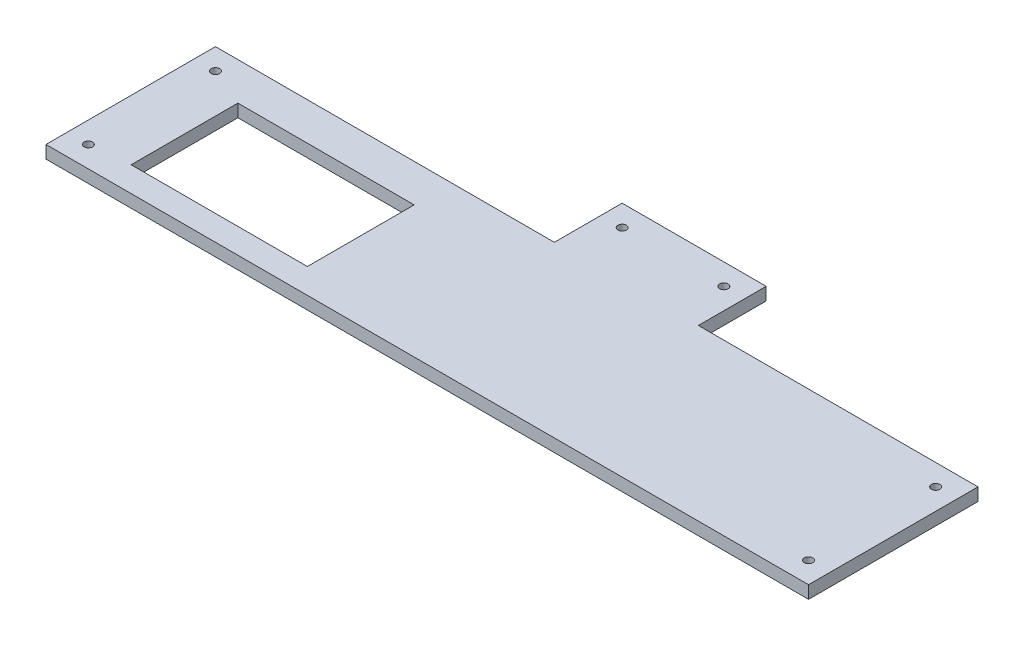
ISO-10303-21;
HEADER;
FILE_DESCRIPTION(('STEP AP214'),'2;1');
FILE_NAME('part.step','',(''),(''),'','','');
FILE_SCHEMA(('AUTOMOTIVE_DESIGN { 1 0 10303 214 1 1 1 1 }'));
ENDSEC;
DATA;
#1=APPLICATION_CONTEXT('core data for automotive mechanical design processes');
#2=APPLICATION_PROTOCOL_DEFINITION('international standard','automotive_design',2000,#1);
#3=PRODUCT_CONTEXT('',#1,'mechanical');
#4=PRODUCT('Part','Part','',(#3));
#5=PRODUCT_RELATED_PRODUCT_CATEGORY('part','',(#4));
#6=PRODUCT_DEFINITION_FORMATION('','',#4);
#7=PRODUCT_DEFINITION_CONTEXT('part definition',#1,'design');
#8=PRODUCT_DEFINITION('design','',#6,#7);
#9=PRODUCT_DEFINITION_SHAPE('','',#8);
#10=(LENGTH_UNIT() NAMED_UNIT(*) SI_UNIT(.MILLI.,.METRE.));
#11=(NAMED_UNIT(*) PLANE_ANGLE_UNIT() SI_UNIT($,.RADIAN.));
#12=(NAMED_UNIT(*) SI_UNIT($,.STERADIAN.) SOLID_ANGLE_UNIT());
#13=UNCERTAINTY_MEASURE_WITH_UNIT(LENGTH_MEASURE(1.E-05),#10,'distance_accuracy_value','');
#14=(GEOMETRIC_REPRESENTATION_CONTEXT(3) GLOBAL_UNCERTAINTY_ASSIGNED_CONTEXT((#13)) GLOBAL_UNIT_ASSIGNED_CONTEXT((#10,
#11,#12)) REPRESENTATION_CONTEXT('',''));
#15=CARTESIAN_POINT('',(0.,0.,0.));
#16=DIRECTION('',(0.,0.,1.));
#17=DIRECTION('',(1.,0.,0.));
#18=AXIS2_PLACEMENT_3D('',#15,#16,#17);
#19=CARTESIAN_POINT('',(450.,-15.,-100.000000000001));
#20=DIRECTION('',(0.,0.,-1.));
#21=DIRECTION('',(-1.,0.,0.));
#22=AXIS2_PLACEMENT_3D('',#19,#20,#21);
#23=PLANE('',#22);
#24=DIRECTION('',(-1.,0.,0.));
#25=VECTOR('',#24,1.);
#26=CARTESIAN_POINT('',(450.,-15.,-100.000000000001));
#27=LINE('',#26,#25);
#28=CARTESIAN_POINT('',(450.,-15.,-100.000000000001));
#29=VERTEX_POINT('',#28);
#30=CARTESIAN_POINT('',(120.,-15.,-100.000000000001));
#31=VERTEX_POINT('',#30);
#32=EDGE_CURVE('E224',#29,#31,#27,.T.);
#33=ORIENTED_EDGE('',*,*,#32,.T.);
#34=DIRECTION('',(0.,1.,0.));
#35=VECTOR('',#34,1.);
#36=CARTESIAN_POINT('',(120.,-15.,-100.000000000001));
#37=LINE('',#36,#35);
#38=CARTESIAN_POINT('',(120.,0.,-100.000000000001));
#39=VERTEX_POINT('',#38);
#40=EDGE_CURVE('E147',#31,#39,#37,.T.);
#41=ORIENTED_EDGE('',*,*,#40,.T.);
#42=DIRECTION('',(-1.,0.,0.));
#43=VECTOR('',#42,1.);
#44=CARTESIAN_POINT('',(450.,0.,-100.000000000001));
#45=LINE('',#44,#43);
#46=CARTESIAN_POINT('',(450.,0.,-100.000000000001));
#47=VERTEX_POINT('',#46);
#48=EDGE_CURVE('E235',#47,#39,#45,.T.);
#49=ORIENTED_EDGE('',*,*,#48,.F.);
#50=DIRECTION('',(0.,1.,0.));
#51=VECTOR('',#50,1.);
#52=CARTESIAN_POINT('',(450.,-15.,-100.000000000001));
#53=LINE('',#52,#51);
#54=EDGE_CURVE('E39',#29,#47,#53,.T.);
#55=ORIENTED_EDGE('',*,*,#54,.F.);
#56=EDGE_LOOP('',(#33,#41,#49,#55));
#57=FACE_BOUND('',#56,.T.);
#58=ADVANCED_FACE('F35',(#57),#23,.T.);
#59=CARTESIAN_POINT('',(450.,-15.,100.000000000001));
#60=DIRECTION('',(1.,0.,0.));
#61=DIRECTION('',(0.,0.,-1.));
#62=AXIS2_PLACEMENT_3D('',#59,#60,#61);
#63=PLANE('',#62);
#64=DIRECTION('',(0.,0.,-1.));
#65=VECTOR('',#64,1.);
#66=CARTESIAN_POINT('',(450.,0.,100.000000000001));
#67=LINE('',#66,#65);
#68=CARTESIAN_POINT('',(450.,0.,100.000000000001));
#69=VERTEX_POINT('',#68);
#70=EDGE_CURVE('E216',#69,#47,#67,.T.);
#71=ORIENTED_EDGE('',*,*,#70,.F.);
#72=DIRECTION('',(0.,1.,0.));
#73=VECTOR('',#72,1.);
#74=CARTESIAN_POINT('',(450.,-15.,100.000000000001));
#75=LINE('',#74,#73);
#76=CARTESIAN_POINT('',(450.,-15.,100.000000000001));
#77=VERTEX_POINT('',#76);
#78=EDGE_CURVE('E11',#77,#69,#75,.T.);
#79=ORIENTED_EDGE('',*,*,#78,.F.);
#80=DIRECTION('',(0.,0.,-1.));
#81=VECTOR('',#80,1.);
#82=CARTESIAN_POINT('',(450.,-15.,100.000000000001));
#83=LINE('',#82,#81);
#84=EDGE_CURVE('E219',#77,#29,#83,.T.);
#85=ORIENTED_EDGE('',*,*,#84,.T.);
#86=ORIENTED_EDGE('',*,*,#54,.T.);
#87=EDGE_LOOP('',(#71,#79,#85,#86));
#88=FACE_BOUND('',#87,.T.);
#89=ADVANCED_FACE('F37',(#88),#63,.T.);
#90=CARTESIAN_POINT('',(-450.,-15.,100.000000000001));
#91=DIRECTION('',(0.,0.,1.));
#92=DIRECTION('',(1.,0.,0.));
#93=AXIS2_PLACEMENT_3D('',#90,#91,#92);
#94=PLANE('',#93);
#95=DIRECTION('',(1.,0.,0.));
#96=VECTOR('',#95,1.);
#97=CARTESIAN_POINT('',(-450.,0.,100.000000000001));
#98=LINE('',#97,#96);
#99=CARTESIAN_POINT('',(-450.,0.,100.000000000001));
#100=VERTEX_POINT('',#99);
#101=EDGE_CURVE('E223',#100,#69,#98,.T.);
#102=ORIENTED_EDGE('',*,*,#101,.F.);
#103=DIRECTION('',(0.,1.,0.));
#104=VECTOR('',#103,1.);
#105=CARTESIAN_POINT('',(-450.,-15.,100.000000000001));
#106=LINE('',#105,#104);
#107=CARTESIAN_POINT('',(-450.,-15.,100.000000000001));
#108=VERTEX_POINT('',#107);
#109=EDGE_CURVE('E44',#108,#100,#106,.T.);
#110=ORIENTED_EDGE('',*,*,#109,.F.);
#111=DIRECTION('',(1.,0.,0.));
#112=VECTOR('',#111,1.);
#113=CARTESIAN_POINT('',(-450.,-15.,100.000000000001));
#114=LINE('',#113,#112);
#115=EDGE_CURVE('E229',#108,#77,#114,.T.);
#116=ORIENTED_EDGE('',*,*,#115,.T.);
#117=ORIENTED_EDGE('',*,*,#78,.T.);
#118=EDGE_LOOP('',(#102,#110,#116,#117));
#119=FACE_BOUND('',#118,.T.);
#120=ADVANCED_FACE('F258',(#119),#94,.T.);
#121=CARTESIAN_POINT('',(-450.,-15.,-100.));
#122=DIRECTION('',(-1.,0.,0.));
#123=DIRECTION('',(0.,0.,1.));
#124=AXIS2_PLACEMENT_3D('',#121,#122,#123);
#125=PLANE('',#124);
#126=DIRECTION('',(0.,0.,1.));
#127=VECTOR('',#126,1.);
#128=CARTESIAN_POINT('',(-450.,0.,-100.));
#129=LINE('',#128,#127);
#130=CARTESIAN_POINT('',(-450.,0.,-100.));
#131=VERTEX_POINT('',#130);
#132=EDGE_CURVE('E238',#131,#100,#129,.T.);
#133=ORIENTED_EDGE('',*,*,#132,.F.);
#134=DIRECTION('',(0.,1.,0.));
#135=VECTOR('',#134,1.);
#136=CARTESIAN_POINT('',(-450.,-15.,-100.));
#137=LINE('',#136,#135);
#138=CARTESIAN_POINT('',(-450.,-15.,-100.));
#139=VERTEX_POINT('',#138);
#140=EDGE_CURVE('E243',#139,#131,#137,.T.);
#141=ORIENTED_EDGE('',*,*,#140,.F.);
#142=DIRECTION('',(0.,0.,1.));
#143=VECTOR('',#142,1.);
#144=CARTESIAN_POINT('',(-450.,-15.,-100.));
#145=LINE('',#144,#143);
#146=EDGE_CURVE('E226',#139,#108,#145,.T.);
#147=ORIENTED_EDGE('',*,*,#146,.T.);
#148=ORIENTED_EDGE('',*,*,#109,.T.);
#149=EDGE_LOOP('',(#133,#141,#147,#148));
#150=FACE_BOUND('',#149,.T.);
#151=ADVANCED_FACE('F262',(#150),#125,.T.);
#152=DIRECTION('',(0.,1.,0.));
#153=VECTOR('',#152,1.);
#154=CARTESIAN_POINT('',(-50.,-15.,-100.000000000001));
#155=LINE('',#154,#153);
#156=CARTESIAN_POINT('',(-50.,-15.,-100.000000000001));
#157=VERTEX_POINT('',#156);
#158=CARTESIAN_POINT('',(-50.,0.,-100.000000000001));
#159=VERTEX_POINT('',#158);
#160=EDGE_CURVE('E161',#157,#159,#155,.T.);
#161=ORIENTED_EDGE('',*,*,#160,.F.);
#162=EDGE_CURVE('E222',#157,#139,#27,.T.);
#163=ORIENTED_EDGE('',*,*,#162,.T.);
#164=ORIENTED_EDGE('',*,*,#140,.T.);
#165=EDGE_CURVE('E234',#159,#131,#45,.T.);
#166=ORIENTED_EDGE('',*,*,#165,.F.);
#167=EDGE_LOOP('',(#161,#163,#164,#166));
#168=FACE_BOUND('',#167,.T.);
#169=ADVANCED_FACE('F264',(#168),#23,.T.);
#170=CARTESIAN_POINT('',(0.,-15.,0.));
#171=DIRECTION('',(0.,1.,0.));
#172=DIRECTION('',(0.,0.,1.));
#173=AXIS2_PLACEMENT_3D('',#170,#171,#172);
#174=PLANE('',#173);
#175=DIRECTION('',(1.,0.,0.));
#176=VECTOR('',#175,1.);
#177=CARTESIAN_POINT('',(-379.,-15.,-55.5000000000002));
#178=LINE('',#177,#176);
#179=CARTESIAN_POINT('',(-379.,-15.,-55.5000000000002));
#180=VERTEX_POINT('',#179);
#181=CARTESIAN_POINT('',(-171.,-15.,-55.5000000000002));
#182=VERTEX_POINT('',#181);
#183=EDGE_CURVE('E179',#180,#182,#178,.T.);
#184=ORIENTED_EDGE('',*,*,#183,.F.);
#185=DIRECTION('',(0.,0.,-1.));
#186=VECTOR('',#185,1.);
#187=CARTESIAN_POINT('',(-379.,-15.,70.5));
#188=LINE('',#187,#186);
#189=CARTESIAN_POINT('',(-379.,-15.,70.5));
#190=VERTEX_POINT('',#189);
#191=EDGE_CURVE('E60',#190,#180,#188,.T.);
#192=ORIENTED_EDGE('',*,*,#191,.F.);
#193=DIRECTION('',(-1.,0.,0.));
#194=VECTOR('',#193,1.);
#195=CARTESIAN_POINT('',(-379.,-15.,70.5));
#196=LINE('',#195,#194);
#197=CARTESIAN_POINT('',(-171.,-15.,70.5));
#198=VERTEX_POINT('',#197);
#199=EDGE_CURVE('E168',#198,#190,#196,.T.);
#200=ORIENTED_EDGE('',*,*,#199,.F.);
#201=DIRECTION('',(0.,0.,1.));
#202=VECTOR('',#201,1.);
#203=CARTESIAN_POINT('',(-171.,-15.,70.5));
#204=LINE('',#203,#202);
#205=EDGE_CURVE('E182',#182,#198,#204,.T.);
#206=ORIENTED_EDGE('',*,*,#205,.F.);
#207=EDGE_LOOP('',(#184,#192,#200,#206));
#208=FACE_BOUND('',#207,.T.);
#209=CARTESIAN_POINT('',(-425.,-15.,-75.0000000000004));
#210=DIRECTION('',(0.,1.,0.));
#211=DIRECTION('',(0.,0.,1.));
#212=AXIS2_PLACEMENT_3D('',#209,#210,#211);
#213=CIRCLE('',#212,4.99999999999999);
#214=CARTESIAN_POINT('',(-425.,-15.,-70.0000000000004));
#215=VERTEX_POINT('',#214);
#216=EDGE_CURVE('E195',#215,#215,#213,.T.);
#217=ORIENTED_EDGE('',*,*,#216,.T.);
#218=EDGE_LOOP('',(#217));
#219=FACE_BOUND('',#218,.T.);
#220=CARTESIAN_POINT('',(-425.,-15.,75.000000000001));
#221=DIRECTION('',(0.,1.,0.));
#222=DIRECTION('',(0.,0.,1.));
#223=AXIS2_PLACEMENT_3D('',#220,#221,#222);
#224=CIRCLE('',#223,4.99999999999999);
#225=CARTESIAN_POINT('',(-425.,-15.,80.000000000001));
#226=VERTEX_POINT('',#225);
#227=EDGE_CURVE('E201',#226,#226,#224,.T.);
#228=ORIENTED_EDGE('',*,*,#227,.T.);
#229=EDGE_LOOP('',(#228));
#230=FACE_BOUND('',#229,.T.);
#231=CARTESIAN_POINT('',(425.,-15.,-75.000000000001));
#232=DIRECTION('',(0.,1.,0.));
#233=DIRECTION('',(0.,0.,1.));
#234=AXIS2_PLACEMENT_3D('',#231,#232,#233);
#235=CIRCLE('',#234,4.99999999999999);
#236=CARTESIAN_POINT('',(425.,-15.,-70.000000000001));
#237=VERTEX_POINT('',#236);
#238=EDGE_CURVE('E207',#237,#237,#235,.T.);
#239=ORIENTED_EDGE('',*,*,#238,.T.);
#240=EDGE_LOOP('',(#239));
#241=FACE_BOUND('',#240,.T.);
#242=CARTESIAN_POINT('',(425.,-15.,75.000000000001));
#243=DIRECTION('',(0.,1.,0.));
#244=DIRECTION('',(0.,0.,1.));
#245=AXIS2_PLACEMENT_3D('',#242,#243,#244);
#246=CIRCLE('',#245,4.99999999999999);
#247=CARTESIAN_POINT('',(425.,-15.,80.000000000001));
#248=VERTEX_POINT('',#247);
#249=EDGE_CURVE('E213',#248,#248,#246,.T.);
#250=ORIENTED_EDGE('',*,*,#249,.T.);
#251=EDGE_LOOP('',(#250));
#252=FACE_BOUND('',#251,.T.);
#253=ORIENTED_EDGE('',*,*,#84,.F.);
#254=ORIENTED_EDGE('',*,*,#115,.F.);
#255=ORIENTED_EDGE('',*,*,#146,.F.);
#256=ORIENTED_EDGE('',*,*,#162,.F.);
#257=DIRECTION('',(0.,0.,1.));
#258=VECTOR('',#257,1.);
#259=CARTESIAN_POINT('',(-50.,-15.,-100.000000000001));
#260=LINE('',#259,#258);
#261=CARTESIAN_POINT('',(-50.,-15.,-180.));
#262=VERTEX_POINT('',#261);
#263=EDGE_CURVE('E133',#262,#157,#260,.T.);
#264=ORIENTED_EDGE('',*,*,#263,.F.);
#265=DIRECTION('',(-1.,0.,0.));
#266=VECTOR('',#265,1.);
#267=CARTESIAN_POINT('',(120.,-15.,-180.));
#268=LINE('',#267,#266);
#269=CARTESIAN_POINT('',(120.,-15.,-180.));
#270=VERTEX_POINT('',#269);
#271=EDGE_CURVE('E128',#270,#262,#268,.T.);
#272=ORIENTED_EDGE('',*,*,#271,.F.);
#273=DIRECTION('',(0.,0.,-1.));
#274=VECTOR('',#273,1.);
#275=CARTESIAN_POINT('',(120.,-15.,-100.000000000001));
#276=LINE('',#275,#274);
#277=EDGE_CURVE('E142',#31,#270,#276,.T.);
#278=ORIENTED_EDGE('',*,*,#277,.F.);
#279=ORIENTED_EDGE('',*,*,#32,.F.);
#280=EDGE_LOOP('',(#253,#254,#255,#256,#264,#272,#278,#279));
#281=FACE_BOUND('',#280,.T.);
#282=CARTESIAN_POINT('',(-25.,-15.,-155.));
#283=DIRECTION('',(0.,1.,0.));
#284=DIRECTION('',(0.,0.,-1.));
#285=AXIS2_PLACEMENT_3D('',#282,#283,#284);
#286=CIRCLE('',#285,4.99999999999999);
#287=CARTESIAN_POINT('',(-25.,-15.,-160.));
#288=VERTEX_POINT('',#287);
#289=EDGE_CURVE('E447',#288,#288,#286,.T.);
#290=ORIENTED_EDGE('',*,*,#289,.T.);
#291=EDGE_LOOP('',(#290));
#292=FACE_BOUND('',#291,.T.);
#293=CARTESIAN_POINT('',(95.0000000000002,-15.,-155.));
#294=DIRECTION('',(0.,1.,0.));
#295=DIRECTION('',(0.,0.,1.));
#296=AXIS2_PLACEMENT_3D('',#293,#294,#295);
#297=CIRCLE('',#296,4.99999999999999);
#298=CARTESIAN_POINT('',(95.0000000000002,-15.,-150.));
#299=VERTEX_POINT('',#298);
#300=EDGE_CURVE('E158',#299,#299,#297,.T.);
#301=ORIENTED_EDGE('',*,*,#300,.T.);
#302=EDGE_LOOP('',(#301));
#303=FACE_BOUND('',#302,.T.);
#304=ADVANCED_FACE('F139',(#208,#219,#230,#241,#252,#281,#292,#303),#174,.F.);
#305=CARTESIAN_POINT('',(0.,0.,0.));
#306=DIRECTION('',(0.,1.,0.));
#307=DIRECTION('',(0.,0.,1.));
#308=AXIS2_PLACEMENT_3D('',#305,#306,#307);
#309=PLANE('',#308);
#310=DIRECTION('',(0.,0.,-1.));
#311=VECTOR('',#310,1.);
#312=CARTESIAN_POINT('',(-379.,0.,70.5));
#313=LINE('',#312,#311);
#314=CARTESIAN_POINT('',(-379.,0.,70.5));
#315=VERTEX_POINT('',#314);
#316=CARTESIAN_POINT('',(-379.,0.,-55.5000000000002));
#317=VERTEX_POINT('',#316);
#318=EDGE_CURVE('E164',#315,#317,#313,.T.);
#319=ORIENTED_EDGE('',*,*,#318,.T.);
#320=DIRECTION('',(1.,0.,0.));
#321=VECTOR('',#320,1.);
#322=CARTESIAN_POINT('',(-379.,0.,-55.5000000000002));
#323=LINE('',#322,#321);
#324=CARTESIAN_POINT('',(-171.,0.,-55.5000000000002));
#325=VERTEX_POINT('',#324);
#326=EDGE_CURVE('E167',#317,#325,#323,.T.);
#327=ORIENTED_EDGE('',*,*,#326,.T.);
#328=DIRECTION('',(0.,0.,1.));
#329=VECTOR('',#328,1.);
#330=CARTESIAN_POINT('',(-171.,0.,70.5));
#331=LINE('',#330,#329);
#332=CARTESIAN_POINT('',(-171.,0.,70.5));
#333=VERTEX_POINT('',#332);
#334=EDGE_CURVE('E171',#325,#333,#331,.T.);
#335=ORIENTED_EDGE('',*,*,#334,.T.);
#336=DIRECTION('',(-1.,0.,0.));
#337=VECTOR('',#336,1.);
#338=CARTESIAN_POINT('',(-379.,0.,70.5));
#339=LINE('',#338,#337);
#340=EDGE_CURVE('E174',#333,#315,#339,.T.);
#341=ORIENTED_EDGE('',*,*,#340,.T.);
#342=EDGE_LOOP('',(#319,#327,#335,#341));
#343=FACE_BOUND('',#342,.T.);
#344=CARTESIAN_POINT('',(-425.,0.,-75.0000000000004));
#345=DIRECTION('',(0.,1.,0.));
#346=DIRECTION('',(0.,0.,1.));
#347=AXIS2_PLACEMENT_3D('',#344,#345,#346);
#348=CIRCLE('',#347,4.99999999999999);
#349=CARTESIAN_POINT('',(-425.,0.,-70.0000000000004));
#350=VERTEX_POINT('',#349);
#351=EDGE_CURVE('E189',#350,#350,#348,.T.);
#352=ORIENTED_EDGE('',*,*,#351,.F.);
#353=EDGE_LOOP('',(#352));
#354=FACE_BOUND('',#353,.T.);
#355=CARTESIAN_POINT('',(-425.,0.,75.000000000001));
#356=DIRECTION('',(0.,1.,0.));
#357=DIRECTION('',(0.,0.,1.));
#358=AXIS2_PLACEMENT_3D('',#355,#356,#357);
#359=CIRCLE('',#358,4.99999999999999);
#360=CARTESIAN_POINT('',(-425.,0.,80.000000000001));
#361=VERTEX_POINT('',#360);
#362=EDGE_CURVE('E198',#361,#361,#359,.T.);
#363=ORIENTED_EDGE('',*,*,#362,.F.);
#364=EDGE_LOOP('',(#363));
#365=FACE_BOUND('',#364,.T.);
#366=CARTESIAN_POINT('',(425.,0.,-75.000000000001));
#367=DIRECTION('',(0.,1.,0.));
#368=DIRECTION('',(0.,0.,1.));
#369=AXIS2_PLACEMENT_3D('',#366,#367,#368);
#370=CIRCLE('',#369,4.99999999999999);
#371=CARTESIAN_POINT('',(425.,0.,-70.000000000001));
#372=VERTEX_POINT('',#371);
#373=EDGE_CURVE('E204',#372,#372,#370,.T.);
#374=ORIENTED_EDGE('',*,*,#373,.F.);
#375=EDGE_LOOP('',(#374));
#376=FACE_BOUND('',#375,.T.);
#377=CARTESIAN_POINT('',(425.,0.,75.000000000001));
#378=DIRECTION('',(0.,1.,0.));
#379=DIRECTION('',(0.,0.,1.));
#380=AXIS2_PLACEMENT_3D('',#377,#378,#379);
#381=CIRCLE('',#380,4.99999999999999);
#382=CARTESIAN_POINT('',(425.,0.,80.000000000001));
#383=VERTEX_POINT('',#382);
#384=EDGE_CURVE('E210',#383,#383,#381,.T.);
#385=ORIENTED_EDGE('',*,*,#384,.F.);
#386=EDGE_LOOP('',(#385));
#387=FACE_BOUND('',#386,.T.);
#388=ORIENTED_EDGE('',*,*,#70,.T.);
#389=ORIENTED_EDGE('',*,*,#48,.T.);
#390=DIRECTION('',(0.,0.,-1.));
#391=VECTOR('',#390,1.);
#392=CARTESIAN_POINT('',(120.,0.,-100.000000000001));
#393=LINE('',#392,#391);
#394=CARTESIAN_POINT('',(120.,0.,-180.));
#395=VERTEX_POINT('',#394);
#396=EDGE_CURVE('E52',#39,#395,#393,.T.);
#397=ORIENTED_EDGE('',*,*,#396,.T.);
#398=DIRECTION('',(-1.,0.,0.));
#399=VECTOR('',#398,1.);
#400=CARTESIAN_POINT('',(120.,0.,-180.));
#401=LINE('',#400,#399);
#402=CARTESIAN_POINT('',(-50.,0.,-180.));
#403=VERTEX_POINT('',#402);
#404=EDGE_CURVE('E130',#395,#403,#401,.T.);
#405=ORIENTED_EDGE('',*,*,#404,.T.);
#406=DIRECTION('',(0.,0.,1.));
#407=VECTOR('',#406,1.);
#408=CARTESIAN_POINT('',(-50.,0.,-100.000000000001));
#409=LINE('',#408,#407);
#410=EDGE_CURVE('E148',#403,#159,#409,.T.);
#411=ORIENTED_EDGE('',*,*,#410,.T.);
#412=ORIENTED_EDGE('',*,*,#165,.T.);
#413=ORIENTED_EDGE('',*,*,#132,.T.);
#414=ORIENTED_EDGE('',*,*,#101,.T.);
#415=EDGE_LOOP('',(#388,#389,#397,#405,#411,#412,#413,#414));
#416=FACE_BOUND('',#415,.T.);
#417=CARTESIAN_POINT('',(-25.,0.,-155.));
#418=DIRECTION('',(0.,1.,0.));
#419=DIRECTION('',(0.,0.,-1.));
#420=AXIS2_PLACEMENT_3D('',#417,#418,#419);
#421=CIRCLE('',#420,4.99999999999999);
#422=CARTESIAN_POINT('',(-25.,0.,-160.));
#423=VERTEX_POINT('',#422);
#424=EDGE_CURVE('E450',#423,#423,#421,.T.);
#425=ORIENTED_EDGE('',*,*,#424,.F.);
#426=EDGE_LOOP('',(#425));
#427=FACE_BOUND('',#426,.T.);
#428=CARTESIAN_POINT('',(95.0000000000002,0.,-155.));
#429=DIRECTION('',(0.,1.,0.));
#430=DIRECTION('',(0.,0.,1.));
#431=AXIS2_PLACEMENT_3D('',#428,#429,#430);
#432=CIRCLE('',#431,4.99999999999999);
#433=CARTESIAN_POINT('',(95.0000000000002,0.,-150.));
#434=VERTEX_POINT('',#433);
#435=EDGE_CURVE('E153',#434,#434,#432,.T.);
#436=ORIENTED_EDGE('',*,*,#435,.F.);
#437=EDGE_LOOP('',(#436));
#438=FACE_BOUND('',#437,.T.);
#439=ADVANCED_FACE('F254',(#343,#354,#365,#376,#387,#416,#427,#438),#309,.T.);
#440=CARTESIAN_POINT('',(425.,-15.,75.000000000001));
#441=DIRECTION('',(0.,1.,0.));
#442=DIRECTION('',(0.,0.,1.));
#443=AXIS2_PLACEMENT_3D('',#440,#441,#442);
#444=CYLINDRICAL_SURFACE('',#443,4.99999999999999);
#445=ORIENTED_EDGE('',*,*,#249,.F.);
#446=EDGE_LOOP('',(#445));
#447=FACE_BOUND('',#446,.T.);
#448=ORIENTED_EDGE('',*,*,#384,.T.);
#449=EDGE_LOOP('',(#448));
#450=FACE_BOUND('',#449,.T.);
#451=ADVANCED_FACE('F291',(#447,#450),#444,.F.);
#452=CARTESIAN_POINT('',(425.,-15.,-75.000000000001));
#453=DIRECTION('',(0.,1.,0.));
#454=DIRECTION('',(0.,0.,1.));
#455=AXIS2_PLACEMENT_3D('',#452,#453,#454);
#456=CYLINDRICAL_SURFACE('',#455,4.99999999999999);
#457=ORIENTED_EDGE('',*,*,#238,.F.);
#458=EDGE_LOOP('',(#457));
#459=FACE_BOUND('',#458,.T.);
#460=ORIENTED_EDGE('',*,*,#373,.T.);
#461=EDGE_LOOP('',(#460));
#462=FACE_BOUND('',#461,.T.);
#463=ADVANCED_FACE('F296',(#459,#462),#456,.F.);
#464=CARTESIAN_POINT('',(-425.,-15.,75.000000000001));
#465=DIRECTION('',(0.,1.,0.));
#466=DIRECTION('',(0.,0.,1.));
#467=AXIS2_PLACEMENT_3D('',#464,#465,#466);
#468=CYLINDRICAL_SURFACE('',#467,4.99999999999999);
#469=ORIENTED_EDGE('',*,*,#227,.F.);
#470=EDGE_LOOP('',(#469));
#471=FACE_BOUND('',#470,.T.);
#472=ORIENTED_EDGE('',*,*,#362,.T.);
#473=EDGE_LOOP('',(#472));
#474=FACE_BOUND('',#473,.T.);
#475=ADVANCED_FACE('F308',(#471,#474),#468,.F.);
#476=CARTESIAN_POINT('',(-425.,-15.,-75.0000000000004));
#477=DIRECTION('',(0.,1.,0.));
#478=DIRECTION('',(0.,0.,1.));
#479=AXIS2_PLACEMENT_3D('',#476,#477,#478);
#480=CYLINDRICAL_SURFACE('',#479,4.99999999999999);
#481=ORIENTED_EDGE('',*,*,#216,.F.);
#482=EDGE_LOOP('',(#481));
#483=FACE_BOUND('',#482,.T.);
#484=ORIENTED_EDGE('',*,*,#351,.T.);
#485=EDGE_LOOP('',(#484));
#486=FACE_BOUND('',#485,.T.);
#487=ADVANCED_FACE('F318',(#483,#486),#480,.F.);
#488=CARTESIAN_POINT('',(-379.,0.,70.5));
#489=DIRECTION('',(-1.,0.,0.));
#490=DIRECTION('',(0.,0.,1.));
#491=AXIS2_PLACEMENT_3D('',#488,#489,#490);
#492=PLANE('',#491);
#493=ORIENTED_EDGE('',*,*,#191,.T.);
#494=DIRECTION('',(0.,-1.,0.));
#495=VECTOR('',#494,1.);
#496=CARTESIAN_POINT('',(-379.,0.,-55.5000000000002));
#497=LINE('',#496,#495);
#498=EDGE_CURVE('E177',#317,#180,#497,.T.);
#499=ORIENTED_EDGE('',*,*,#498,.F.);
#500=ORIENTED_EDGE('',*,*,#318,.F.);
#501=DIRECTION('',(0.,-1.,0.));
#502=VECTOR('',#501,1.);
#503=CARTESIAN_POINT('',(-379.,0.,70.5));
#504=LINE('',#503,#502);
#505=EDGE_CURVE('E187',#315,#190,#504,.T.);
#506=ORIENTED_EDGE('',*,*,#505,.T.);
#507=EDGE_LOOP('',(#493,#499,#500,#506));
#508=FACE_BOUND('',#507,.T.);
#509=ADVANCED_FACE('F328',(#508),#492,.F.);
#510=CARTESIAN_POINT('',(-379.,0.,70.5));
#511=DIRECTION('',(0.,0.,1.));
#512=DIRECTION('',(1.,0.,0.));
#513=AXIS2_PLACEMENT_3D('',#510,#511,#512);
#514=PLANE('',#513);
#515=ORIENTED_EDGE('',*,*,#199,.T.);
#516=ORIENTED_EDGE('',*,*,#505,.F.);
#517=ORIENTED_EDGE('',*,*,#340,.F.);
#518=DIRECTION('',(0.,-1.,0.));
#519=VECTOR('',#518,1.);
#520=CARTESIAN_POINT('',(-171.,0.,70.5));
#521=LINE('',#520,#519);
#522=EDGE_CURVE('E190',#333,#198,#521,.T.);
#523=ORIENTED_EDGE('',*,*,#522,.T.);
#524=EDGE_LOOP('',(#515,#516,#517,#523));
#525=FACE_BOUND('',#524,.T.);
#526=ADVANCED_FACE('F338',(#525),#514,.F.);
#527=CARTESIAN_POINT('',(-171.,0.,70.5));
#528=DIRECTION('',(1.,0.,0.));
#529=DIRECTION('',(0.,0.,-1.));
#530=AXIS2_PLACEMENT_3D('',#527,#528,#529);
#531=PLANE('',#530);
#532=ORIENTED_EDGE('',*,*,#205,.T.);
#533=ORIENTED_EDGE('',*,*,#522,.F.);
#534=ORIENTED_EDGE('',*,*,#334,.F.);
#535=DIRECTION('',(0.,-1.,0.));
#536=VECTOR('',#535,1.);
#537=CARTESIAN_POINT('',(-171.,0.,-55.5000000000002));
#538=LINE('',#537,#536);
#539=EDGE_CURVE('E192',#325,#182,#538,.T.);
#540=ORIENTED_EDGE('',*,*,#539,.T.);
#541=EDGE_LOOP('',(#532,#533,#534,#540));
#542=FACE_BOUND('',#541,.T.);
#543=ADVANCED_FACE('F347',(#542),#531,.F.);
#544=CARTESIAN_POINT('',(-379.,0.,-55.5000000000002));
#545=DIRECTION('',(0.,0.,-1.));
#546=DIRECTION('',(-1.,0.,0.));
#547=AXIS2_PLACEMENT_3D('',#544,#545,#546);
#548=PLANE('',#547);
#549=ORIENTED_EDGE('',*,*,#183,.T.);
#550=ORIENTED_EDGE('',*,*,#539,.F.);
#551=ORIENTED_EDGE('',*,*,#326,.F.);
#552=ORIENTED_EDGE('',*,*,#498,.T.);
#553=EDGE_LOOP('',(#549,#550,#551,#552));
#554=FACE_BOUND('',#553,.T.);
#555=ADVANCED_FACE('F357',(#554),#548,.F.);
#556=CARTESIAN_POINT('',(120.,-15.,-100.000000000001));
#557=DIRECTION('',(1.,0.,0.));
#558=DIRECTION('',(0.,0.,-1.));
#559=AXIS2_PLACEMENT_3D('',#556,#557,#558);
#560=PLANE('',#559);
#561=ORIENTED_EDGE('',*,*,#396,.F.);
#562=ORIENTED_EDGE('',*,*,#40,.F.);
#563=ORIENTED_EDGE('',*,*,#277,.T.);
#564=DIRECTION('',(0.,1.,0.));
#565=VECTOR('',#564,1.);
#566=CARTESIAN_POINT('',(120.,-15.,-180.));
#567=LINE('',#566,#565);
#568=EDGE_CURVE('E125',#270,#395,#567,.T.);
#569=ORIENTED_EDGE('',*,*,#568,.T.);
#570=EDGE_LOOP('',(#561,#562,#563,#569));
#571=FACE_BOUND('',#570,.T.);
#572=ADVANCED_FACE('F146',(#571),#560,.T.);
#573=CARTESIAN_POINT('',(-50.,-15.,-100.000000000001));
#574=DIRECTION('',(-1.,0.,0.));
#575=DIRECTION('',(0.,0.,1.));
#576=AXIS2_PLACEMENT_3D('',#573,#574,#575);
#577=PLANE('',#576);
#578=ORIENTED_EDGE('',*,*,#410,.F.);
#579=DIRECTION('',(0.,1.,0.));
#580=VECTOR('',#579,1.);
#581=CARTESIAN_POINT('',(-50.,-15.,-180.));
#582=LINE('',#581,#580);
#583=EDGE_CURVE('E132',#262,#403,#582,.T.);
#584=ORIENTED_EDGE('',*,*,#583,.F.);
#585=ORIENTED_EDGE('',*,*,#263,.T.);
#586=ORIENTED_EDGE('',*,*,#160,.T.);
#587=EDGE_LOOP('',(#578,#584,#585,#586));
#588=FACE_BOUND('',#587,.T.);
#589=ADVANCED_FACE('F403',(#588),#577,.T.);
#590=CARTESIAN_POINT('',(120.,-15.,-180.));
#591=DIRECTION('',(0.,0.,-1.));
#592=DIRECTION('',(-1.,0.,0.));
#593=AXIS2_PLACEMENT_3D('',#590,#591,#592);
#594=PLANE('',#593);
#595=ORIENTED_EDGE('',*,*,#404,.F.);
#596=ORIENTED_EDGE('',*,*,#568,.F.);
#597=ORIENTED_EDGE('',*,*,#271,.T.);
#598=ORIENTED_EDGE('',*,*,#583,.T.);
#599=EDGE_LOOP('',(#595,#596,#597,#598));
#600=FACE_BOUND('',#599,.T.);
#601=ADVANCED_FACE('F127',(#600),#594,.T.);
#602=CARTESIAN_POINT('',(95.0000000000002,-15.,-155.));
#603=DIRECTION('',(0.,1.,0.));
#604=DIRECTION('',(0.,0.,1.));
#605=AXIS2_PLACEMENT_3D('',#602,#603,#604);
#606=CYLINDRICAL_SURFACE('',#605,4.99999999999999);
#607=ORIENTED_EDGE('',*,*,#300,.F.);
#608=EDGE_LOOP('',(#607));
#609=FACE_BOUND('',#608,.T.);
#610=ORIENTED_EDGE('',*,*,#435,.T.);
#611=EDGE_LOOP('',(#610));
#612=FACE_BOUND('',#611,.T.);
#613=ADVANCED_FACE('F421',(#609,#612),#606,.F.);
#614=CARTESIAN_POINT('',(-25.,-15.,-155.));
#615=DIRECTION('',(0.,1.,0.));
#616=DIRECTION('',(0.,0.,1.));
#617=AXIS2_PLACEMENT_3D('',#614,#615,#616);
#618=CYLINDRICAL_SURFACE('',#617,4.99999999999999);
#619=ORIENTED_EDGE('',*,*,#289,.F.);
#620=EDGE_LOOP('',(#619));
#621=FACE_BOUND('',#620,.T.);
#622=ORIENTED_EDGE('',*,*,#424,.T.);
#623=EDGE_LOOP('',(#622));
#624=FACE_BOUND('',#623,.T.);
#625=ADVANCED_FACE('F430',(#621,#624),#618,.F.);
#626=CLOSED_SHELL('',(#58,#89,#120,#151,#169,#304,#439,#451,#463,#475,#487,#509,#526,#543,#555,
#572,#589,#601,#613,#625));
#627=MANIFOLD_SOLID_BREP('B2',#626);
#628=ADVANCED_BREP_SHAPE_REPRESENTATION('',(#18,#627),#14);
#629=SHAPE_DEFINITION_REPRESENTATION(#9,#628);
ENDSEC;
END-ISO-10303-21;
